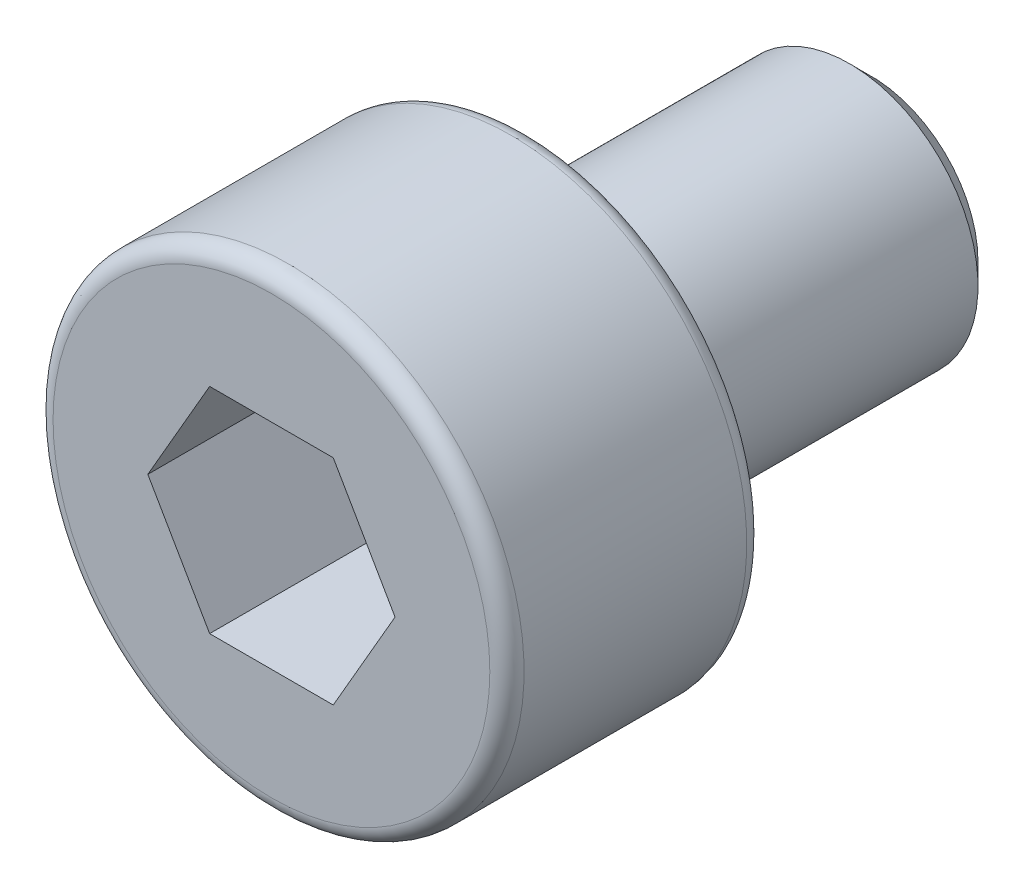
ISO-10303-21;
HEADER;
FILE_DESCRIPTION(('STEP AP214'),'2;1');
FILE_NAME('part.step','',(''),(''),'','','');
FILE_SCHEMA(('AUTOMOTIVE_DESIGN { 1 0 10303 214 1 1 1 1 }'));
ENDSEC;
DATA;
#1=APPLICATION_CONTEXT('core data for automotive mechanical design processes');
#2=APPLICATION_PROTOCOL_DEFINITION('international standard','automotive_design',2000,#1);
#3=PRODUCT_CONTEXT('',#1,'mechanical');
#4=PRODUCT('Part','Part','',(#3));
#5=PRODUCT_RELATED_PRODUCT_CATEGORY('part','',(#4));
#6=PRODUCT_DEFINITION_FORMATION('','',#4);
#7=PRODUCT_DEFINITION_CONTEXT('part definition',#1,'design');
#8=PRODUCT_DEFINITION('design','',#6,#7);
#9=PRODUCT_DEFINITION_SHAPE('','',#8);
#10=(LENGTH_UNIT() NAMED_UNIT(*) SI_UNIT(.MILLI.,.METRE.));
#11=(NAMED_UNIT(*) PLANE_ANGLE_UNIT() SI_UNIT($,.RADIAN.));
#12=(NAMED_UNIT(*) SI_UNIT($,.STERADIAN.) SOLID_ANGLE_UNIT());
#13=UNCERTAINTY_MEASURE_WITH_UNIT(LENGTH_MEASURE(1.E-05),#10,'distance_accuracy_value','');
#14=(GEOMETRIC_REPRESENTATION_CONTEXT(3) GLOBAL_UNCERTAINTY_ASSIGNED_CONTEXT((#13)) GLOBAL_UNIT_ASSIGNED_CONTEXT((#10,
#11,#12)) REPRESENTATION_CONTEXT('',''));
#15=CARTESIAN_POINT('',(0.,0.,0.));
#16=DIRECTION('',(0.,0.,1.));
#17=DIRECTION('',(1.,0.,0.));
#18=AXIS2_PLACEMENT_3D('',#15,#16,#17);
#19=CARTESIAN_POINT('',(0.,0.,4.));
#20=DIRECTION('',(0.,0.,-1.));
#21=DIRECTION('',(-1.,0.,0.));
#22=AXIS2_PLACEMENT_3D('',#19,#20,#21);
#23=PLANE('',#22);
#24=CARTESIAN_POINT('',(0.,0.,4.));
#25=DIRECTION('',(0.,0.,-1.));
#26=DIRECTION('',(-1.,0.,0.));
#27=AXIS2_PLACEMENT_3D('',#24,#25,#26);
#28=CIRCLE('',#27,2.55);
#29=CARTESIAN_POINT('',(-2.55,0.,4.));
#30=VERTEX_POINT('',#29);
#31=EDGE_CURVE('E40',#30,#30,#28,.T.);
#32=ORIENTED_EDGE('',*,*,#31,.T.);
#33=EDGE_LOOP('',(#32));
#34=FACE_BOUND('',#33,.T.);
#35=CARTESIAN_POINT('',(0.,0.,4.));
#36=DIRECTION('',(0.,0.,-1.));
#37=DIRECTION('',(-1.,0.,0.));
#38=AXIS2_PLACEMENT_3D('',#35,#36,#37);
#39=CIRCLE('',#38,1.5);
#40=CARTESIAN_POINT('',(-1.5,0.,4.));
#41=VERTEX_POINT('',#40);
#42=EDGE_CURVE('E134',#41,#41,#39,.T.);
#43=ORIENTED_EDGE('',*,*,#42,.F.);
#44=EDGE_LOOP('',(#43));
#45=FACE_BOUND('',#44,.T.);
#46=ADVANCED_FACE('F32',(#34,#45),#23,.T.);
#47=CARTESIAN_POINT('',(0.,0.,4.));
#48=DIRECTION('',(0.,0.,1.));
#49=DIRECTION('',(1.,0.,0.));
#50=AXIS2_PLACEMENT_3D('',#47,#48,#49);
#51=CYLINDRICAL_SURFACE('',#50,2.75);
#52=CARTESIAN_POINT('',(0.,0.,4.2));
#53=DIRECTION('',(0.,0.,-1.));
#54=DIRECTION('',(-1.,0.,0.));
#55=AXIS2_PLACEMENT_3D('',#52,#53,#54);
#56=CIRCLE('',#55,2.75);
#57=CARTESIAN_POINT('',(-2.75,0.,4.2));
#58=VERTEX_POINT('',#57);
#59=EDGE_CURVE('E151',#58,#58,#56,.F.);
#60=ORIENTED_EDGE('',*,*,#59,.T.);
#61=EDGE_LOOP('',(#60));
#62=FACE_BOUND('',#61,.T.);
#63=CARTESIAN_POINT('',(0.,0.,6.8));
#64=DIRECTION('',(0.,0.,-1.));
#65=DIRECTION('',(-1.,0.,0.));
#66=AXIS2_PLACEMENT_3D('',#63,#64,#65);
#67=CIRCLE('',#66,2.75);
#68=CARTESIAN_POINT('',(-2.75,0.,6.8));
#69=VERTEX_POINT('',#68);
#70=EDGE_CURVE('E148',#69,#69,#67,.T.);
#71=ORIENTED_EDGE('',*,*,#70,.T.);
#72=EDGE_LOOP('',(#71));
#73=FACE_BOUND('',#72,.T.);
#74=ADVANCED_FACE('F164',(#62,#73),#51,.T.);
#75=CARTESIAN_POINT('',(0.,0.,7.));
#76=DIRECTION('',(0.,0.,-1.));
#77=DIRECTION('',(-1.,0.,0.));
#78=AXIS2_PLACEMENT_3D('',#75,#76,#77);
#79=PLANE('',#78);
#80=CARTESIAN_POINT('',(0.,0.,7.));
#81=DIRECTION('',(0.,0.,-1.));
#82=DIRECTION('',(-1.,0.,0.));
#83=AXIS2_PLACEMENT_3D('',#80,#81,#82);
#84=CIRCLE('',#83,2.55);
#85=CARTESIAN_POINT('',(-2.55,0.,7.));
#86=VERTEX_POINT('',#85);
#87=EDGE_CURVE('E11',#86,#86,#84,.F.);
#88=ORIENTED_EDGE('',*,*,#87,.T.);
#89=EDGE_LOOP('',(#88));
#90=FACE_BOUND('',#89,.T.);
#91=DIRECTION('',(0.499999999999997,-0.866025403784441,0.));
#92=VECTOR('',#91,1.);
#93=CARTESIAN_POINT('',(-1.44337567297406,0.,7.));
#94=LINE('',#93,#92);
#95=CARTESIAN_POINT('',(-1.44337567297406,0.,7.));
#96=VERTEX_POINT('',#95);
#97=CARTESIAN_POINT('',(-0.721687836487035,-1.25,7.));
#98=VERTEX_POINT('',#97);
#99=EDGE_CURVE('E121',#96,#98,#94,.T.);
#100=ORIENTED_EDGE('',*,*,#99,.F.);
#101=DIRECTION('',(-0.499999999999998,-0.86602540378444,0.));
#102=VECTOR('',#101,1.);
#103=CARTESIAN_POINT('',(-0.721687836487033,1.25,7.));
#104=LINE('',#103,#102);
#105=CARTESIAN_POINT('',(-0.721687836487033,1.25,7.));
#106=VERTEX_POINT('',#105);
#107=EDGE_CURVE('E47',#106,#96,#104,.T.);
#108=ORIENTED_EDGE('',*,*,#107,.F.);
#109=DIRECTION('',(-1.,0.,0.));
#110=VECTOR('',#109,1.);
#111=CARTESIAN_POINT('',(0.721687836487034,1.25,7.));
#112=LINE('',#111,#110);
#113=CARTESIAN_POINT('',(0.721687836487034,1.25,7.));
#114=VERTEX_POINT('',#113);
#115=EDGE_CURVE('E130',#114,#106,#112,.T.);
#116=ORIENTED_EDGE('',*,*,#115,.F.);
#117=DIRECTION('',(-0.499999999999997,0.86602540378444,0.));
#118=VECTOR('',#117,1.);
#119=CARTESIAN_POINT('',(1.44337567297406,0.,7.));
#120=LINE('',#119,#118);
#121=CARTESIAN_POINT('',(1.44337567297406,0.,7.));
#122=VERTEX_POINT('',#121);
#123=EDGE_CURVE('E128',#122,#114,#120,.T.);
#124=ORIENTED_EDGE('',*,*,#123,.F.);
#125=DIRECTION('',(0.499999999999998,0.86602540378444,0.));
#126=VECTOR('',#125,1.);
#127=CARTESIAN_POINT('',(0.721687836487033,-1.25,7.));
#128=LINE('',#127,#126);
#129=CARTESIAN_POINT('',(0.721687836487033,-1.25,7.));
#130=VERTEX_POINT('',#129);
#131=EDGE_CURVE('E95',#130,#122,#128,.T.);
#132=ORIENTED_EDGE('',*,*,#131,.F.);
#133=DIRECTION('',(1.,0.,0.));
#134=VECTOR('',#133,1.);
#135=CARTESIAN_POINT('',(-0.721687836487035,-1.25,7.));
#136=LINE('',#135,#134);
#137=EDGE_CURVE('E124',#98,#130,#136,.T.);
#138=ORIENTED_EDGE('',*,*,#137,.F.);
#139=EDGE_LOOP('',(#100,#108,#116,#124,#132,#138));
#140=FACE_BOUND('',#139,.T.);
#141=ADVANCED_FACE('F167',(#90,#140),#79,.F.);
#142=CARTESIAN_POINT('',(0.,0.,0.));
#143=DIRECTION('',(0.,0.,1.));
#144=DIRECTION('',(1.,0.,0.));
#145=AXIS2_PLACEMENT_3D('',#142,#143,#144);
#146=CYLINDRICAL_SURFACE('',#145,1.5);
#147=CARTESIAN_POINT('',(0.,0.,0.249999999957936));
#148=DIRECTION('',(0.,0.,-1.));
#149=DIRECTION('',(-1.,0.,0.));
#150=AXIS2_PLACEMENT_3D('',#147,#148,#149);
#151=CIRCLE('',#150,1.5);
#152=CARTESIAN_POINT('',(-1.5,0.,0.249999999957936));
#153=VERTEX_POINT('',#152);
#154=EDGE_CURVE('E145',#153,#153,#151,.F.);
#155=ORIENTED_EDGE('',*,*,#154,.T.);
#156=EDGE_LOOP('',(#155));
#157=FACE_BOUND('',#156,.T.);
#158=ORIENTED_EDGE('',*,*,#42,.T.);
#159=EDGE_LOOP('',(#158));
#160=FACE_BOUND('',#159,.T.);
#161=ADVANCED_FACE('F177',(#157,#160),#146,.T.);
#162=CARTESIAN_POINT('',(0.,0.,0.));
#163=DIRECTION('',(0.,0.,-1.));
#164=DIRECTION('',(-1.,0.,0.));
#165=AXIS2_PLACEMENT_3D('',#162,#163,#164);
#166=PLANE('',#165);
#167=CARTESIAN_POINT('',(0.,0.,0.));
#168=DIRECTION('',(0.,0.,-1.));
#169=DIRECTION('',(-1.,0.,0.));
#170=AXIS2_PLACEMENT_3D('',#167,#168,#169);
#171=CIRCLE('',#170,1.25000000004207);
#172=CARTESIAN_POINT('',(-1.25000000004207,0.,0.));
#173=VERTEX_POINT('',#172);
#174=EDGE_CURVE('E142',#173,#173,#171,.T.);
#175=ORIENTED_EDGE('',*,*,#174,.T.);
#176=EDGE_LOOP('',(#175));
#177=FACE_BOUND('',#176,.T.);
#178=ADVANCED_FACE('F188',(#177),#166,.T.);
#179=CARTESIAN_POINT('',(-0.721687836487033,1.25,5.));
#180=DIRECTION('',(-0.86602540378444,0.499999999999999,0.));
#181=DIRECTION('',(-0.499999999999999,-0.86602540378444,0.));
#182=AXIS2_PLACEMENT_3D('',#179,#180,#181);
#183=PLANE('',#182);
#184=ORIENTED_EDGE('',*,*,#107,.T.);
#185=DIRECTION('',(0.,0.,1.));
#186=VECTOR('',#185,1.);
#187=CARTESIAN_POINT('',(-1.44337567297406,0.,5.));
#188=LINE('',#187,#186);
#189=CARTESIAN_POINT('',(-1.44337567297406,0.,5.));
#190=VERTEX_POINT('',#189);
#191=EDGE_CURVE('E77',#190,#96,#188,.T.);
#192=ORIENTED_EDGE('',*,*,#191,.F.);
#193=DIRECTION('',(-0.499999999999998,-0.86602540378444,0.));
#194=VECTOR('',#193,1.);
#195=CARTESIAN_POINT('',(-0.721687836487033,1.25,5.));
#196=LINE('',#195,#194);
#197=CARTESIAN_POINT('',(-0.721687836487033,1.25,5.));
#198=VERTEX_POINT('',#197);
#199=EDGE_CURVE('E132',#198,#190,#196,.T.);
#200=ORIENTED_EDGE('',*,*,#199,.F.);
#201=DIRECTION('',(0.,0.,1.));
#202=VECTOR('',#201,1.);
#203=CARTESIAN_POINT('',(-0.721687836487033,1.25,5.));
#204=LINE('',#203,#202);
#205=EDGE_CURVE('E55',#198,#106,#204,.T.);
#206=ORIENTED_EDGE('',*,*,#205,.T.);
#207=EDGE_LOOP('',(#184,#192,#200,#206));
#208=FACE_BOUND('',#207,.T.);
#209=ADVANCED_FACE('F185',(#208),#183,.F.);
#210=CARTESIAN_POINT('',(0.721687836487034,1.25,5.));
#211=DIRECTION('',(0.,1.,0.));
#212=DIRECTION('',(0.,0.,1.));
#213=AXIS2_PLACEMENT_3D('',#210,#211,#212);
#214=PLANE('',#213);
#215=ORIENTED_EDGE('',*,*,#115,.T.);
#216=ORIENTED_EDGE('',*,*,#205,.F.);
#217=DIRECTION('',(-1.,0.,0.));
#218=VECTOR('',#217,1.);
#219=CARTESIAN_POINT('',(0.721687836487034,1.25,5.));
#220=LINE('',#219,#218);
#221=CARTESIAN_POINT('',(0.721687836487034,1.25,5.));
#222=VERTEX_POINT('',#221);
#223=EDGE_CURVE('E107',#222,#198,#220,.T.);
#224=ORIENTED_EDGE('',*,*,#223,.F.);
#225=DIRECTION('',(0.,0.,1.));
#226=VECTOR('',#225,1.);
#227=CARTESIAN_POINT('',(0.721687836487034,1.25,5.));
#228=LINE('',#227,#226);
#229=EDGE_CURVE('E99',#222,#114,#228,.T.);
#230=ORIENTED_EDGE('',*,*,#229,.T.);
#231=EDGE_LOOP('',(#215,#216,#224,#230));
#232=FACE_BOUND('',#231,.T.);
#233=ADVANCED_FACE('F187',(#232),#214,.F.);
#234=CARTESIAN_POINT('',(1.44337567297406,0.,5.));
#235=DIRECTION('',(0.866025403784441,0.499999999999997,0.));
#236=DIRECTION('',(-0.499999999999997,0.86602540378444,0.));
#237=AXIS2_PLACEMENT_3D('',#234,#235,#236);
#238=PLANE('',#237);
#239=ORIENTED_EDGE('',*,*,#123,.T.);
#240=ORIENTED_EDGE('',*,*,#229,.F.);
#241=DIRECTION('',(-0.499999999999997,0.86602540378444,0.));
#242=VECTOR('',#241,1.);
#243=CARTESIAN_POINT('',(1.44337567297406,0.,5.));
#244=LINE('',#243,#242);
#245=CARTESIAN_POINT('',(1.44337567297406,0.,5.));
#246=VERTEX_POINT('',#245);
#247=EDGE_CURVE('E103',#246,#222,#244,.T.);
#248=ORIENTED_EDGE('',*,*,#247,.F.);
#249=DIRECTION('',(0.,0.,1.));
#250=VECTOR('',#249,1.);
#251=CARTESIAN_POINT('',(1.44337567297406,0.,5.));
#252=LINE('',#251,#250);
#253=EDGE_CURVE('E88',#246,#122,#252,.T.);
#254=ORIENTED_EDGE('',*,*,#253,.T.);
#255=EDGE_LOOP('',(#239,#240,#248,#254));
#256=FACE_BOUND('',#255,.T.);
#257=ADVANCED_FACE('F104',(#256),#238,.F.);
#258=CARTESIAN_POINT('',(0.721687836487033,-1.25,5.));
#259=DIRECTION('',(0.86602540378444,-0.499999999999998,0.));
#260=DIRECTION('',(0.499999999999998,0.86602540378444,0.));
#261=AXIS2_PLACEMENT_3D('',#258,#259,#260);
#262=PLANE('',#261);
#263=ORIENTED_EDGE('',*,*,#131,.T.);
#264=ORIENTED_EDGE('',*,*,#253,.F.);
#265=DIRECTION('',(0.499999999999998,0.86602540378444,0.));
#266=VECTOR('',#265,1.);
#267=CARTESIAN_POINT('',(0.721687836487033,-1.25,5.));
#268=LINE('',#267,#266);
#269=CARTESIAN_POINT('',(0.721687836487033,-1.25,5.));
#270=VERTEX_POINT('',#269);
#271=EDGE_CURVE('E92',#270,#246,#268,.T.);
#272=ORIENTED_EDGE('',*,*,#271,.F.);
#273=DIRECTION('',(0.,0.,1.));
#274=VECTOR('',#273,1.);
#275=CARTESIAN_POINT('',(0.721687836487033,-1.25,5.));
#276=LINE('',#275,#274);
#277=EDGE_CURVE('E100',#270,#130,#276,.T.);
#278=ORIENTED_EDGE('',*,*,#277,.T.);
#279=EDGE_LOOP('',(#263,#264,#272,#278));
#280=FACE_BOUND('',#279,.T.);
#281=ADVANCED_FACE('F90',(#280),#262,.F.);
#282=CARTESIAN_POINT('',(-0.721687836487035,-1.25,5.));
#283=DIRECTION('',(0.,-1.,0.));
#284=DIRECTION('',(0.,0.,-1.));
#285=AXIS2_PLACEMENT_3D('',#282,#283,#284);
#286=PLANE('',#285);
#287=ORIENTED_EDGE('',*,*,#137,.T.);
#288=ORIENTED_EDGE('',*,*,#277,.F.);
#289=DIRECTION('',(1.,0.,0.));
#290=VECTOR('',#289,1.);
#291=CARTESIAN_POINT('',(-0.721687836487035,-1.25,5.));
#292=LINE('',#291,#290);
#293=CARTESIAN_POINT('',(-0.721687836487035,-1.25,5.));
#294=VERTEX_POINT('',#293);
#295=EDGE_CURVE('E113',#294,#270,#292,.T.);
#296=ORIENTED_EDGE('',*,*,#295,.F.);
#297=DIRECTION('',(0.,0.,1.));
#298=VECTOR('',#297,1.);
#299=CARTESIAN_POINT('',(-0.721687836487035,-1.25,5.));
#300=LINE('',#299,#298);
#301=EDGE_CURVE('E137',#294,#98,#300,.T.);
#302=ORIENTED_EDGE('',*,*,#301,.T.);
#303=EDGE_LOOP('',(#287,#288,#296,#302));
#304=FACE_BOUND('',#303,.T.);
#305=ADVANCED_FACE('F273',(#304),#286,.F.);
#306=CARTESIAN_POINT('',(-1.44337567297406,0.,5.));
#307=DIRECTION('',(-0.866025403784441,-0.499999999999997,0.));
#308=DIRECTION('',(0.499999999999997,-0.866025403784441,0.));
#309=AXIS2_PLACEMENT_3D('',#306,#307,#308);
#310=PLANE('',#309);
#311=ORIENTED_EDGE('',*,*,#99,.T.);
#312=ORIENTED_EDGE('',*,*,#301,.F.);
#313=DIRECTION('',(0.499999999999997,-0.866025403784441,0.));
#314=VECTOR('',#313,1.);
#315=CARTESIAN_POINT('',(-1.44337567297406,0.,5.));
#316=LINE('',#315,#314);
#317=EDGE_CURVE('E115',#190,#294,#316,.T.);
#318=ORIENTED_EDGE('',*,*,#317,.F.);
#319=ORIENTED_EDGE('',*,*,#191,.T.);
#320=EDGE_LOOP('',(#311,#312,#318,#319));
#321=FACE_BOUND('',#320,.T.);
#322=ADVANCED_FACE('F183',(#321),#310,.F.);
#323=CARTESIAN_POINT('',(0.,0.,5.));
#324=DIRECTION('',(0.,0.,1.));
#325=DIRECTION('',(1.,0.,0.));
#326=AXIS2_PLACEMENT_3D('',#323,#324,#325);
#327=PLANE('',#326);
#328=ORIENTED_EDGE('',*,*,#199,.T.);
#329=ORIENTED_EDGE('',*,*,#317,.T.);
#330=ORIENTED_EDGE('',*,*,#295,.T.);
#331=ORIENTED_EDGE('',*,*,#271,.T.);
#332=ORIENTED_EDGE('',*,*,#247,.T.);
#333=ORIENTED_EDGE('',*,*,#223,.T.);
#334=EDGE_LOOP('',(#328,#329,#330,#331,#332,#333));
#335=FACE_BOUND('',#334,.T.);
#336=ADVANCED_FACE('F110',(#335),#327,.T.);
#337=CARTESIAN_POINT('',(0.,0.,0.));
#338=DIRECTION('',(0.,0.,1.));
#339=DIRECTION('',(1.,0.,0.));
#340=AXIS2_PLACEMENT_3D('',#337,#338,#339);
#341=CONICAL_SURFACE('',#340,1.25000000004207,0.785398163397442);
#342=ORIENTED_EDGE('',*,*,#154,.F.);
#343=EDGE_LOOP('',(#342));
#344=FACE_BOUND('',#343,.T.);
#345=ORIENTED_EDGE('',*,*,#174,.F.);
#346=EDGE_LOOP('',(#345));
#347=FACE_BOUND('',#346,.T.);
#348=ADVANCED_FACE('F161',(#344,#347),#341,.T.);
#349=CARTESIAN_POINT('',(0.,0.,4.2));
#350=DIRECTION('',(0.,0.,-1.));
#351=DIRECTION('',(-1.,0.,0.));
#352=AXIS2_PLACEMENT_3D('',#349,#350,#351);
#353=TOROIDAL_SURFACE('',#352,2.55,0.2);
#354=ORIENTED_EDGE('',*,*,#31,.F.);
#355=EDGE_LOOP('',(#354));
#356=FACE_BOUND('',#355,.T.);
#357=ORIENTED_EDGE('',*,*,#59,.F.);
#358=EDGE_LOOP('',(#357));
#359=FACE_BOUND('',#358,.T.);
#360=ADVANCED_FACE('F158',(#356,#359),#353,.T.);
#361=CARTESIAN_POINT('',(0.,0.,6.8));
#362=DIRECTION('',(0.,0.,-1.));
#363=DIRECTION('',(-1.,0.,0.));
#364=AXIS2_PLACEMENT_3D('',#361,#362,#363);
#365=TOROIDAL_SURFACE('',#364,2.55,0.2);
#366=ORIENTED_EDGE('',*,*,#70,.F.);
#367=EDGE_LOOP('',(#366));
#368=FACE_BOUND('',#367,.T.);
#369=ORIENTED_EDGE('',*,*,#87,.F.);
#370=EDGE_LOOP('',(#369));
#371=FACE_BOUND('',#370,.T.);
#372=ADVANCED_FACE('F34',(#368,#371),#365,.T.);
#373=CLOSED_SHELL('',(#46,#74,#141,#161,#178,#209,#233,#257,#281,#305,#322,#336,#348,#360,#372));
#374=MANIFOLD_SOLID_BREP('B2',#373);
#375=ADVANCED_BREP_SHAPE_REPRESENTATION('',(#18,#374),#14);
#376=SHAPE_DEFINITION_REPRESENTATION(#9,#375);
ENDSEC;
END-ISO-10303-21;
